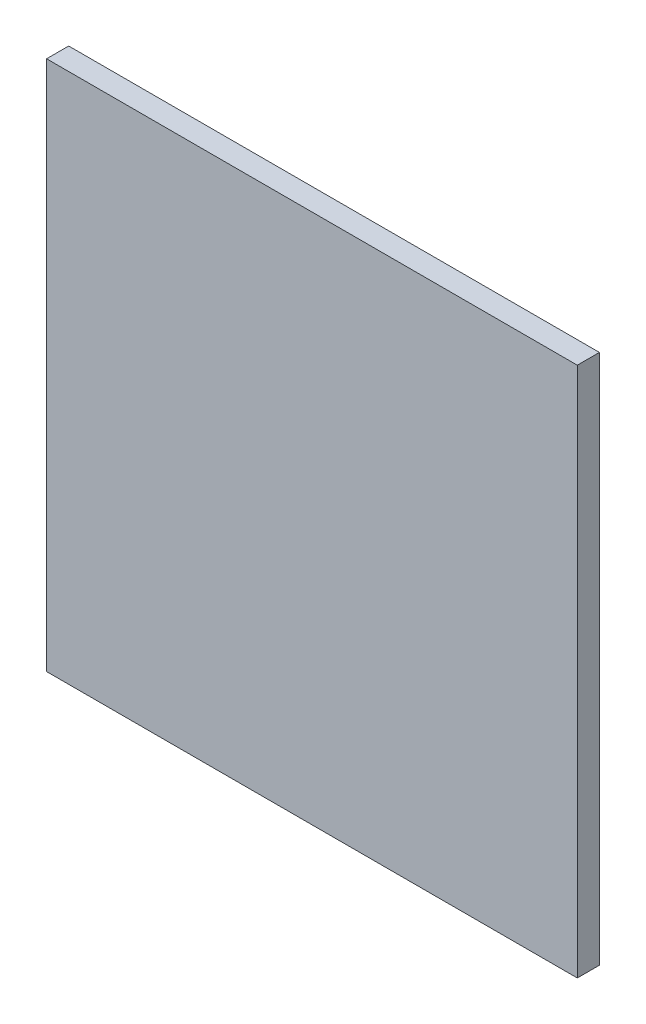
ISO-10303-21;
HEADER;
FILE_DESCRIPTION(('STEP AP214'),'2;1');
FILE_NAME('part.step','',(''),(''),'','','');
FILE_SCHEMA(('AUTOMOTIVE_DESIGN { 1 0 10303 214 1 1 1 1 }'));
ENDSEC;
DATA;
#1=APPLICATION_CONTEXT('core data for automotive mechanical design processes');
#2=APPLICATION_PROTOCOL_DEFINITION('international standard','automotive_design',2000,#1);
#3=PRODUCT_CONTEXT('',#1,'mechanical');
#4=PRODUCT('Part','Part','',(#3));
#5=PRODUCT_RELATED_PRODUCT_CATEGORY('part','',(#4));
#6=PRODUCT_DEFINITION_FORMATION('','',#4);
#7=PRODUCT_DEFINITION_CONTEXT('part definition',#1,'design');
#8=PRODUCT_DEFINITION('design','',#6,#7);
#9=PRODUCT_DEFINITION_SHAPE('','',#8);
#10=(LENGTH_UNIT() NAMED_UNIT(*) SI_UNIT(.MILLI.,.METRE.));
#11=(NAMED_UNIT(*) PLANE_ANGLE_UNIT() SI_UNIT($,.RADIAN.));
#12=(NAMED_UNIT(*) SI_UNIT($,.STERADIAN.) SOLID_ANGLE_UNIT());
#13=UNCERTAINTY_MEASURE_WITH_UNIT(LENGTH_MEASURE(1.E-05),#10,'distance_accuracy_value','');
#14=(GEOMETRIC_REPRESENTATION_CONTEXT(3) GLOBAL_UNCERTAINTY_ASSIGNED_CONTEXT((#13)) GLOBAL_UNIT_ASSIGNED_CONTEXT((#10,
#11,#12)) REPRESENTATION_CONTEXT('',''));
#15=CARTESIAN_POINT('',(0.,0.,0.));
#16=DIRECTION('',(0.,0.,1.));
#17=DIRECTION('',(1.,0.,0.));
#18=AXIS2_PLACEMENT_3D('',#15,#16,#17);
#19=CARTESIAN_POINT('',(-1524.,-1524.,127.));
#20=DIRECTION('',(1.,0.,0.));
#21=DIRECTION('',(0.,0.,-1.));
#22=AXIS2_PLACEMENT_3D('',#19,#20,#21);
#23=PLANE('',#22);
#24=DIRECTION('',(0.,-1.,0.));
#25=VECTOR('',#24,1.);
#26=CARTESIAN_POINT('',(-1524.,-1524.,0.));
#27=LINE('',#26,#25);
#28=CARTESIAN_POINT('',(-1524.,1524.,0.));
#29=VERTEX_POINT('',#28);
#30=CARTESIAN_POINT('',(-1524.,-1524.,0.));
#31=VERTEX_POINT('',#30);
#32=EDGE_CURVE('E96',#29,#31,#27,.T.);
#33=ORIENTED_EDGE('',*,*,#32,.T.);
#34=DIRECTION('',(0.,0.,-1.));
#35=VECTOR('',#34,1.);
#36=CARTESIAN_POINT('',(-1524.,-1524.,127.));
#37=LINE('',#36,#35);
#38=CARTESIAN_POINT('',(-1524.,-1524.,127.));
#39=VERTEX_POINT('',#38);
#40=EDGE_CURVE('E11',#39,#31,#37,.T.);
#41=ORIENTED_EDGE('',*,*,#40,.F.);
#42=DIRECTION('',(0.,-1.,0.));
#43=VECTOR('',#42,1.);
#44=CARTESIAN_POINT('',(-1524.,-1524.,127.));
#45=LINE('',#44,#43);
#46=CARTESIAN_POINT('',(-1524.,1524.,127.));
#47=VERTEX_POINT('',#46);
#48=EDGE_CURVE('E84',#47,#39,#45,.T.);
#49=ORIENTED_EDGE('',*,*,#48,.F.);
#50=DIRECTION('',(0.,0.,-1.));
#51=VECTOR('',#50,1.);
#52=CARTESIAN_POINT('',(-1524.,1524.,127.));
#53=LINE('',#52,#51);
#54=EDGE_CURVE('E92',#47,#29,#53,.T.);
#55=ORIENTED_EDGE('',*,*,#54,.T.);
#56=EDGE_LOOP('',(#33,#41,#49,#55));
#57=FACE_BOUND('',#56,.T.);
#58=ADVANCED_FACE('F33',(#57),#23,.F.);
#59=CARTESIAN_POINT('',(-1524.,-1524.,127.));
#60=DIRECTION('',(0.,1.,0.));
#61=DIRECTION('',(0.,0.,1.));
#62=AXIS2_PLACEMENT_3D('',#59,#60,#61);
#63=PLANE('',#62);
#64=DIRECTION('',(1.,0.,0.));
#65=VECTOR('',#64,1.);
#66=CARTESIAN_POINT('',(-1524.,-1524.,0.));
#67=LINE('',#66,#65);
#68=CARTESIAN_POINT('',(1524.,-1524.,0.));
#69=VERTEX_POINT('',#68);
#70=EDGE_CURVE('E88',#31,#69,#67,.T.);
#71=ORIENTED_EDGE('',*,*,#70,.T.);
#72=DIRECTION('',(0.,0.,-1.));
#73=VECTOR('',#72,1.);
#74=CARTESIAN_POINT('',(1524.,-1524.,127.));
#75=LINE('',#74,#73);
#76=CARTESIAN_POINT('',(1524.,-1524.,127.));
#77=VERTEX_POINT('',#76);
#78=EDGE_CURVE('E41',#77,#69,#75,.T.);
#79=ORIENTED_EDGE('',*,*,#78,.F.);
#80=DIRECTION('',(1.,0.,0.));
#81=VECTOR('',#80,1.);
#82=CARTESIAN_POINT('',(-1524.,-1524.,127.));
#83=LINE('',#82,#81);
#84=EDGE_CURVE('E79',#39,#77,#83,.T.);
#85=ORIENTED_EDGE('',*,*,#84,.F.);
#86=ORIENTED_EDGE('',*,*,#40,.T.);
#87=EDGE_LOOP('',(#71,#79,#85,#86));
#88=FACE_BOUND('',#87,.T.);
#89=ADVANCED_FACE('F87',(#88),#63,.F.);
#90=CARTESIAN_POINT('',(1524.,-1524.,127.));
#91=DIRECTION('',(-1.,0.,0.));
#92=DIRECTION('',(0.,0.,1.));
#93=AXIS2_PLACEMENT_3D('',#90,#91,#92);
#94=PLANE('',#93);
#95=DIRECTION('',(0.,1.,0.));
#96=VECTOR('',#95,1.);
#97=CARTESIAN_POINT('',(1524.,-1524.,0.));
#98=LINE('',#97,#96);
#99=CARTESIAN_POINT('',(1524.,1524.,0.));
#100=VERTEX_POINT('',#99);
#101=EDGE_CURVE('E66',#69,#100,#98,.T.);
#102=ORIENTED_EDGE('',*,*,#101,.T.);
#103=DIRECTION('',(0.,0.,-1.));
#104=VECTOR('',#103,1.);
#105=CARTESIAN_POINT('',(1524.,1524.,127.));
#106=LINE('',#105,#104);
#107=CARTESIAN_POINT('',(1524.,1524.,127.));
#108=VERTEX_POINT('',#107);
#109=EDGE_CURVE('E89',#108,#100,#106,.T.);
#110=ORIENTED_EDGE('',*,*,#109,.F.);
#111=DIRECTION('',(0.,1.,0.));
#112=VECTOR('',#111,1.);
#113=CARTESIAN_POINT('',(1524.,-1524.,127.));
#114=LINE('',#113,#112);
#115=EDGE_CURVE('E82',#77,#108,#114,.T.);
#116=ORIENTED_EDGE('',*,*,#115,.F.);
#117=ORIENTED_EDGE('',*,*,#78,.T.);
#118=EDGE_LOOP('',(#102,#110,#116,#117));
#119=FACE_BOUND('',#118,.T.);
#120=ADVANCED_FACE('F90',(#119),#94,.F.);
#121=CARTESIAN_POINT('',(-1524.,1524.,127.));
#122=DIRECTION('',(0.,-1.,0.));
#123=DIRECTION('',(0.,0.,-1.));
#124=AXIS2_PLACEMENT_3D('',#121,#122,#123);
#125=PLANE('',#124);
#126=DIRECTION('',(-1.,0.,0.));
#127=VECTOR('',#126,1.);
#128=CARTESIAN_POINT('',(-1524.,1524.,0.));
#129=LINE('',#128,#127);
#130=EDGE_CURVE('E72',#100,#29,#129,.T.);
#131=ORIENTED_EDGE('',*,*,#130,.T.);
#132=ORIENTED_EDGE('',*,*,#54,.F.);
#133=DIRECTION('',(-1.,0.,0.));
#134=VECTOR('',#133,1.);
#135=CARTESIAN_POINT('',(-1524.,1524.,127.));
#136=LINE('',#135,#134);
#137=EDGE_CURVE('E49',#108,#47,#136,.T.);
#138=ORIENTED_EDGE('',*,*,#137,.F.);
#139=ORIENTED_EDGE('',*,*,#109,.T.);
#140=EDGE_LOOP('',(#131,#132,#138,#139));
#141=FACE_BOUND('',#140,.T.);
#142=ADVANCED_FACE('F103',(#141),#125,.F.);
#143=CARTESIAN_POINT('',(0.,0.,127.));
#144=DIRECTION('',(0.,0.,-1.));
#145=DIRECTION('',(-1.,0.,0.));
#146=AXIS2_PLACEMENT_3D('',#143,#144,#145);
#147=PLANE('',#146);
#148=ORIENTED_EDGE('',*,*,#48,.T.);
#149=ORIENTED_EDGE('',*,*,#84,.T.);
#150=ORIENTED_EDGE('',*,*,#115,.T.);
#151=ORIENTED_EDGE('',*,*,#137,.T.);
#152=EDGE_LOOP('',(#148,#149,#150,#151));
#153=FACE_BOUND('',#152,.T.);
#154=ADVANCED_FACE('F80',(#153),#147,.F.);
#155=CARTESIAN_POINT('',(0.,0.,0.));
#156=DIRECTION('',(0.,0.,-1.));
#157=DIRECTION('',(-1.,0.,0.));
#158=AXIS2_PLACEMENT_3D('',#155,#156,#157);
#159=PLANE('',#158);
#160=ORIENTED_EDGE('',*,*,#32,.F.);
#161=ORIENTED_EDGE('',*,*,#130,.F.);
#162=ORIENTED_EDGE('',*,*,#101,.F.);
#163=ORIENTED_EDGE('',*,*,#70,.F.);
#164=EDGE_LOOP('',(#160,#161,#162,#163));
#165=FACE_BOUND('',#164,.T.);
#166=ADVANCED_FACE('F106',(#165),#159,.T.);
#167=CLOSED_SHELL('',(#58,#89,#120,#142,#154,#166));
#168=MANIFOLD_SOLID_BREP('B2',#167);
#169=ADVANCED_BREP_SHAPE_REPRESENTATION('',(#18,#168),#14);
#170=SHAPE_DEFINITION_REPRESENTATION(#9,#169);
ENDSEC;
END-ISO-10303-21;
